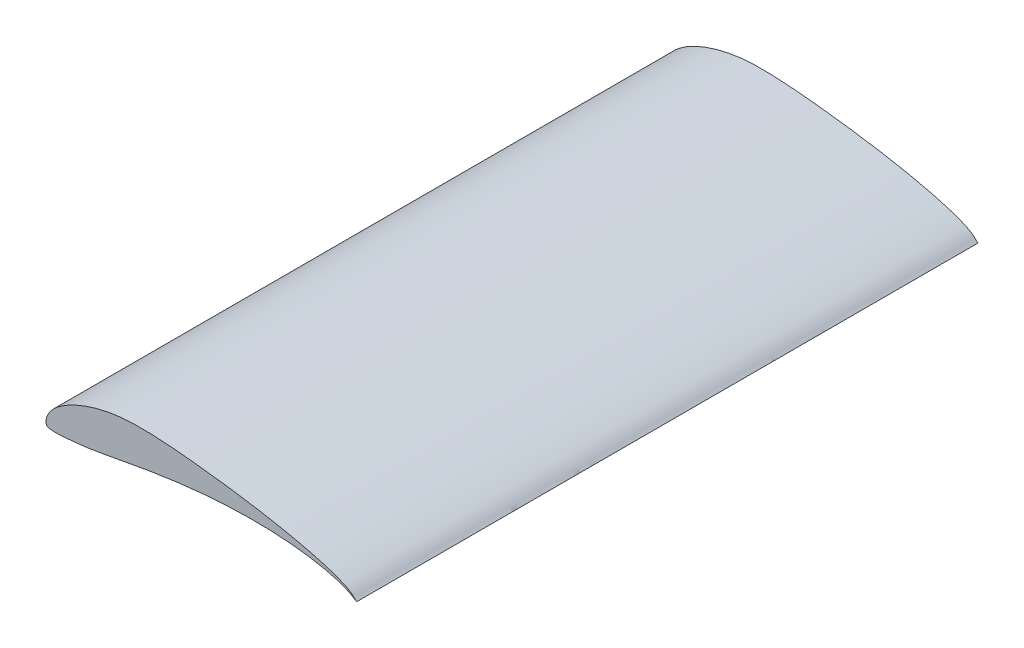
ISO-10303-21;
HEADER;
FILE_DESCRIPTION(('STEP AP214'),'2;1');
FILE_NAME('part.step','',(''),(''),'','','');
FILE_SCHEMA(('AUTOMOTIVE_DESIGN { 1 0 10303 214 1 1 1 1 }'));
ENDSEC;
DATA;
#1=APPLICATION_CONTEXT('core data for automotive mechanical design processes');
#2=APPLICATION_PROTOCOL_DEFINITION('international standard','automotive_design',2000,#1);
#3=PRODUCT_CONTEXT('',#1,'mechanical');
#4=PRODUCT('Part','Part','',(#3));
#5=PRODUCT_RELATED_PRODUCT_CATEGORY('part','',(#4));
#6=PRODUCT_DEFINITION_FORMATION('','',#4);
#7=PRODUCT_DEFINITION_CONTEXT('part definition',#1,'design');
#8=PRODUCT_DEFINITION('design','',#6,#7);
#9=PRODUCT_DEFINITION_SHAPE('','',#8);
#10=(LENGTH_UNIT() NAMED_UNIT(*) SI_UNIT(.MILLI.,.METRE.));
#11=(NAMED_UNIT(*) PLANE_ANGLE_UNIT() SI_UNIT($,.RADIAN.));
#12=(NAMED_UNIT(*) SI_UNIT($,.STERADIAN.) SOLID_ANGLE_UNIT());
#13=UNCERTAINTY_MEASURE_WITH_UNIT(LENGTH_MEASURE(1.E-05),#10,'distance_accuracy_value','');
#14=(GEOMETRIC_REPRESENTATION_CONTEXT(3) GLOBAL_UNCERTAINTY_ASSIGNED_CONTEXT((#13)) GLOBAL_UNIT_ASSIGNED_CONTEXT((#10,
#11,#12)) REPRESENTATION_CONTEXT('',''));
#15=CARTESIAN_POINT('',(0.,0.,0.));
#16=DIRECTION('',(0.,0.,1.));
#17=DIRECTION('',(1.,0.,0.));
#18=AXIS2_PLACEMENT_3D('',#15,#16,#17);
#19=CARTESIAN_POINT('',(127.,0.,254.));
#20=CARTESIAN_POINT('',(127.000769717104,0.00323111728238874,254.));
#21=CARTESIAN_POINT('',(126.584141571627,0.315526649127548,254.));
#22=CARTESIAN_POINT('',(126.232031088116,0.663013823384949,254.));
#23=CARTESIAN_POINT('',(125.450071515346,1.38894381615488,254.));
#24=CARTESIAN_POINT('',(124.527299188332,2.16145764303241,254.));
#25=CARTESIAN_POINT('',(123.264224261657,2.94120075058822,254.));
#26=CARTESIAN_POINT('',(121.692964678594,3.69786480489537,254.));
#27=CARTESIAN_POINT('',(119.795728434605,4.48828044969158,254.));
#28=CARTESIAN_POINT('',(117.575379306662,5.30151004594058,254.));
#29=CARTESIAN_POINT('',(115.042270284879,6.13182416217699,254.));
#30=CARTESIAN_POINT('',(112.209543307113,6.97203931013939,254.));
#31=CARTESIAN_POINT('',(109.093063036859,7.81820448790323,254.));
#32=CARTESIAN_POINT('',(105.710028463209,8.66258332306238,254.));
#33=CARTESIAN_POINT('',(102.079831769463,9.49907815033768,254.));
#34=CARTESIAN_POINT('',(98.2241091397372,10.3224672327435,254.));
#35=CARTESIAN_POINT('',(94.1664076748728,11.1285069384014,254.));
#36=CARTESIAN_POINT('',(89.9304279655555,11.907354391189,254.));
#37=CARTESIAN_POINT('',(85.5428555735686,12.6578371250276,254.));
#38=CARTESIAN_POINT('',(81.0289612385541,13.3703816088197,254.));
#39=CARTESIAN_POINT('',(76.4179534766854,14.0462691823256,254.));
#40=CARTESIAN_POINT('',(71.7393804373853,14.6801640087939,254.));
#41=CARTESIAN_POINT('',(67.027136305624,15.2699828938957,254.));
#42=CARTESIAN_POINT('',(62.3189170365685,15.819696414956,254.));
#43=CARTESIAN_POINT('',(57.6536733692796,16.315664975441,254.));
#44=CARTESIAN_POINT('',(53.0693975715884,16.7487487072031,254.));
#45=CARTESIAN_POINT('',(48.5982718516275,17.0952249192146,254.));
#46=CARTESIAN_POINT('',(44.2657908448699,17.3371937722352,254.));
#47=CARTESIAN_POINT('',(40.0959852964538,17.4483403282716,254.));
#48=CARTESIAN_POINT('',(36.1102779812264,17.4493292025915,254.));
#49=CARTESIAN_POINT('',(32.3158867258376,17.2651586305284,254.));
#50=CARTESIAN_POINT('',(28.7112964421394,16.8801239890788,254.));
#51=CARTESIAN_POINT('',(25.2819441912323,16.3308530728459,254.));
#52=CARTESIAN_POINT('',(22.0269983212429,15.6158399508502,254.));
#53=CARTESIAN_POINT('',(18.9499169212991,14.7752462603599,254.));
#54=CARTESIAN_POINT('',(16.0637526450945,13.8240801560353,254.));
#55=CARTESIAN_POINT('',(13.3808332120453,12.7847443469678,254.));
#56=CARTESIAN_POINT('',(10.9178280022335,11.6628005697599,254.));
#57=CARTESIAN_POINT('',(8.68269161985856,10.4811492130559,254.));
#58=CARTESIAN_POINT('',(6.68760433730356,9.25326624654448,254.));
#59=CARTESIAN_POINT('',(4.94510354432059,7.9958325077971,254.));
#60=CARTESIAN_POINT('',(3.45598413292439,6.73560541904248,254.));
#61=CARTESIAN_POINT('',(2.2417479304945,5.45871938189445,254.));
#62=CARTESIAN_POINT('',(1.30818660016137,4.17624592770146,254.));
#63=CARTESIAN_POINT('',(0.617717297341459,2.92793982113451,254.));
#64=CARTESIAN_POINT('',(0.174083023561414,1.74211895284198,254.));
#65=CARTESIAN_POINT('',(-0.0388427252765965,0.647037813552721,254.));
#66=CARTESIAN_POINT('',(-0.0010363601489231,-0.279771871501658,254.));
#67=CARTESIAN_POINT('',(0.235084443775435,-1.13038870603616,254.));
#68=CARTESIAN_POINT('',(1.1207056730532,-1.55486500810244,254.));
#69=CARTESIAN_POINT('',(2.31290546534907,-1.6175084795852,254.));
#70=CARTESIAN_POINT('',(3.94389865384399,-1.67959896057599,254.));
#71=CARTESIAN_POINT('',(5.99545250140033,-1.59707940753716,254.));
#72=CARTESIAN_POINT('',(8.44417570451747,-1.44160929478364,254.));
#73=CARTESIAN_POINT('',(11.262890425615,-1.18938590251411,254.));
#74=CARTESIAN_POINT('',(14.4227440425413,-0.84622408188668,254.));
#75=CARTESIAN_POINT('',(17.908355129713,-0.404519447860457,254.));
#76=CARTESIAN_POINT('',(21.7182529770942,0.215901377104077,254.));
#77=CARTESIAN_POINT('',(25.8709229619219,0.995707517581131,254.));
#78=CARTESIAN_POINT('',(30.3868524277044,1.8443955725859,254.));
#79=CARTESIAN_POINT('',(35.2439169835582,2.74023122487108,254.));
#80=CARTESIAN_POINT('',(40.4115163949612,3.64553629731007,254.));
#81=CARTESIAN_POINT('',(45.8516192348338,4.52588455050029,254.));
#82=CARTESIAN_POINT('',(51.5219543271074,5.35147544565327,254.));
#83=CARTESIAN_POINT('',(57.3735865939118,6.09156296095057,254.));
#84=CARTESIAN_POINT('',(63.3538498532729,6.72425683934594,254.));
#85=CARTESIAN_POINT('',(69.4061860873322,7.22054004646335,254.));
#86=CARTESIAN_POINT('',(75.4698348185654,7.56721152273309,254.));
#87=CARTESIAN_POINT('',(81.4814157934521,7.75004539608128,254.));
#88=CARTESIAN_POINT('',(87.3756884947152,7.75827737570897,254.));
#89=CARTESIAN_POINT('',(93.086888922288,7.59037940222622,254.));
#90=CARTESIAN_POINT('',(98.5496256871399,7.25008430517508,254.));
#91=CARTESIAN_POINT('',(103.698210977527,6.7417689268573,254.));
#92=CARTESIAN_POINT('',(108.471385615122,6.08455022754242,254.));
#93=CARTESIAN_POINT('',(112.807034181474,5.29727715125957,254.));
#94=CARTESIAN_POINT('',(116.654371920803,4.40604318114848,254.));
#95=CARTESIAN_POINT('',(119.94257377723,3.45478126323133,254.));
#96=CARTESIAN_POINT('',(122.63294953606,2.44188293526373,254.));
#97=CARTESIAN_POINT('',(124.551876795575,1.51652312091327,254.));
#98=CARTESIAN_POINT('',(125.96615188119,0.661946325670215,254.));
#99=CARTESIAN_POINT('',(126.509448596035,0.331250792648228,254.));
#100=CARTESIAN_POINT('',(126.999214634617,-0.00329680560459764,254.));
#101=CARTESIAN_POINT('',(127.,0.,254.));
#102=B_SPLINE_CURVE_WITH_KNOTS('',3,(#19,#20,#21,#22,#23,#24,#25,#26,#27,#28,#29,#30,#31,#32,
#33,#34,#35,#36,#37,#38,#39,#40,#41,#42,#43,#44,#45,#46,#47,#48,#49,#50,#51,#52,#53,#54,#55,#56,
#57,#58,#59,#60,#61,#62,#63,#64,#65,#66,#67,#68,#69,#70,#71,#72,#73,#74,#75,#76,#77,#78,#79,#80,
#81,#82,#83,#84,#85,#86,#87,#88,#89,#90,#91,#92,#93,#94,#95,#96,#97,#98,#99,#100,#101),
.UNSPECIFIED.,.T.,.F.,(4,1,1,1,1,1,1,1,1,1,1,1,1,1,1,1,1,1,1,1,1,1,1,1,1,1,1,1,1,1,1,1,1,1,1,1,
1,1,1,1,1,1,1,1,1,1,1,1,1,1,1,1,1,1,1,1,1,1,1,1,1,1,1,1,1,1,1,1,1,1,1,1,1,1,1,1,1,1,1,1,4),(0.,
0.000979677557134158,0.00364886216776312,0.00748349851947815,0.0120952771855934,
0.0175255907768788,0.0240517799938711,0.0317830505527587,0.0406778280832618,0.050710300790478,
0.0618332290621795,0.0739892504845854,0.0871181731906812,0.101145048769791,0.115990637111827,
0.131570421640589,0.147788379302961,0.164550916882416,0.181757895150531,0.199311954944345,
0.217095071712264,0.234990228463986,0.252856883122009,0.270540593729572,0.287886779266045,
0.304773437599674,0.321101419214061,0.336806063174811,0.351800032584037,0.366031063392082,
0.379615674919835,0.392652962879186,0.405170358707495,0.417171919049936,0.428603516911185,
0.439418959108259,0.449596586064162,0.459102079103161,0.467907877534646,0.475988300736527,
0.483308968746149,0.489874507816402,0.495803249719207,0.501149411695553,0.50590307325604,
0.510046768536663,0.513579310681042,0.516446926626751,0.5193500525909,0.523823355179486,
0.529973793997694,0.537715654387927,0.546967844488146,0.55763736682571,0.569620481096633,
0.582804124215616,0.597246960791632,0.613135036654701,0.630443600329816,0.649056123608545,
0.668822256795696,0.689594964002684,0.711189650864602,0.733426688964389,0.756094117504156,
0.778988553684861,0.801889682684954,0.824566597829707,0.846792284880411,0.868338290507787,
0.888978162959066,0.908492011340558,0.926658767581933,0.943286193042322,0.958169210358795,
0.971135821634751,0.981955623079976,0.990251791025976,0.995852565249962,0.999000405686701,1.),.UNSPECIFIED.);
#103=DIRECTION('',(0.,0.,-1.));
#104=VECTOR('',#103,1.);
#105=SURFACE_OF_LINEAR_EXTRUSION('',#102,#104);
#106=CARTESIAN_POINT('',(127.,0.,254.));
#107=VERTEX_POINT('',#106);
#108=EDGE_CURVE('E10',#107,#107,#102,.T.);
#109=ORIENTED_EDGE('',*,*,#108,.F.);
#110=EDGE_LOOP('',(#109));
#111=FACE_BOUND('',#110,.T.);
#112=CARTESIAN_POINT('',(127.,0.,0.));
#113=CARTESIAN_POINT('',(127.000769717104,0.00323111728238874,0.));
#114=CARTESIAN_POINT('',(126.584141571627,0.315526649127548,0.));
#115=CARTESIAN_POINT('',(126.232031088116,0.663013823384949,0.));
#116=CARTESIAN_POINT('',(125.450071515346,1.38894381615488,0.));
#117=CARTESIAN_POINT('',(124.527299188332,2.16145764303241,0.));
#118=CARTESIAN_POINT('',(123.264224261657,2.94120075058822,0.));
#119=CARTESIAN_POINT('',(121.692964678594,3.69786480489537,0.));
#120=CARTESIAN_POINT('',(119.795728434605,4.48828044969158,0.));
#121=CARTESIAN_POINT('',(117.575379306662,5.30151004594058,0.));
#122=CARTESIAN_POINT('',(115.042270284879,6.13182416217699,0.));
#123=CARTESIAN_POINT('',(112.209543307113,6.97203931013939,0.));
#124=CARTESIAN_POINT('',(109.093063036859,7.81820448790323,0.));
#125=CARTESIAN_POINT('',(105.710028463209,8.66258332306238,0.));
#126=CARTESIAN_POINT('',(102.079831769463,9.49907815033768,0.));
#127=CARTESIAN_POINT('',(98.2241091397372,10.3224672327435,0.));
#128=CARTESIAN_POINT('',(94.1664076748728,11.1285069384014,0.));
#129=CARTESIAN_POINT('',(89.9304279655555,11.907354391189,0.));
#130=CARTESIAN_POINT('',(85.5428555735686,12.6578371250276,0.));
#131=CARTESIAN_POINT('',(81.0289612385541,13.3703816088197,0.));
#132=CARTESIAN_POINT('',(76.4179534766854,14.0462691823256,0.));
#133=CARTESIAN_POINT('',(71.7393804373853,14.6801640087939,0.));
#134=CARTESIAN_POINT('',(67.027136305624,15.2699828938957,0.));
#135=CARTESIAN_POINT('',(62.3189170365685,15.819696414956,0.));
#136=CARTESIAN_POINT('',(57.6536733692796,16.315664975441,0.));
#137=CARTESIAN_POINT('',(53.0693975715884,16.7487487072031,0.));
#138=CARTESIAN_POINT('',(48.5982718516275,17.0952249192146,0.));
#139=CARTESIAN_POINT('',(44.2657908448699,17.3371937722352,0.));
#140=CARTESIAN_POINT('',(40.0959852964538,17.4483403282716,0.));
#141=CARTESIAN_POINT('',(36.1102779812264,17.4493292025915,0.));
#142=CARTESIAN_POINT('',(32.3158867258376,17.2651586305284,0.));
#143=CARTESIAN_POINT('',(28.7112964421394,16.8801239890788,0.));
#144=CARTESIAN_POINT('',(25.2819441912323,16.3308530728459,0.));
#145=CARTESIAN_POINT('',(22.0269983212429,15.6158399508502,0.));
#146=CARTESIAN_POINT('',(18.9499169212991,14.7752462603599,0.));
#147=CARTESIAN_POINT('',(16.0637526450945,13.8240801560353,0.));
#148=CARTESIAN_POINT('',(13.3808332120453,12.7847443469678,0.));
#149=CARTESIAN_POINT('',(10.9178280022335,11.6628005697599,0.));
#150=CARTESIAN_POINT('',(8.68269161985856,10.4811492130559,0.));
#151=CARTESIAN_POINT('',(6.68760433730356,9.25326624654448,0.));
#152=CARTESIAN_POINT('',(4.94510354432059,7.9958325077971,0.));
#153=CARTESIAN_POINT('',(3.45598413292439,6.73560541904248,0.));
#154=CARTESIAN_POINT('',(2.2417479304945,5.45871938189445,0.));
#155=CARTESIAN_POINT('',(1.30818660016137,4.17624592770146,0.));
#156=CARTESIAN_POINT('',(0.617717297341459,2.92793982113451,0.));
#157=CARTESIAN_POINT('',(0.174083023561414,1.74211895284198,0.));
#158=CARTESIAN_POINT('',(-0.0388427252765965,0.647037813552721,0.));
#159=CARTESIAN_POINT('',(-0.0010363601489231,-0.279771871501658,0.));
#160=CARTESIAN_POINT('',(0.235084443775435,-1.13038870603616,0.));
#161=CARTESIAN_POINT('',(1.1207056730532,-1.55486500810244,0.));
#162=CARTESIAN_POINT('',(2.31290546534907,-1.6175084795852,0.));
#163=CARTESIAN_POINT('',(3.94389865384399,-1.67959896057599,0.));
#164=CARTESIAN_POINT('',(5.99545250140033,-1.59707940753716,0.));
#165=CARTESIAN_POINT('',(8.44417570451747,-1.44160929478364,0.));
#166=CARTESIAN_POINT('',(11.262890425615,-1.18938590251411,0.));
#167=CARTESIAN_POINT('',(14.4227440425413,-0.84622408188668,0.));
#168=CARTESIAN_POINT('',(17.908355129713,-0.404519447860457,0.));
#169=CARTESIAN_POINT('',(21.7182529770942,0.215901377104077,0.));
#170=CARTESIAN_POINT('',(25.8709229619219,0.995707517581131,0.));
#171=CARTESIAN_POINT('',(30.3868524277044,1.8443955725859,0.));
#172=CARTESIAN_POINT('',(35.2439169835582,2.74023122487108,0.));
#173=CARTESIAN_POINT('',(40.4115163949612,3.64553629731007,0.));
#174=CARTESIAN_POINT('',(45.8516192348338,4.52588455050029,0.));
#175=CARTESIAN_POINT('',(51.5219543271074,5.35147544565327,0.));
#176=CARTESIAN_POINT('',(57.3735865939118,6.09156296095057,0.));
#177=CARTESIAN_POINT('',(63.3538498532729,6.72425683934594,0.));
#178=CARTESIAN_POINT('',(69.4061860873322,7.22054004646335,0.));
#179=CARTESIAN_POINT('',(75.4698348185654,7.56721152273309,0.));
#180=CARTESIAN_POINT('',(81.4814157934521,7.75004539608128,0.));
#181=CARTESIAN_POINT('',(87.3756884947152,7.75827737570897,0.));
#182=CARTESIAN_POINT('',(93.086888922288,7.59037940222622,0.));
#183=CARTESIAN_POINT('',(98.5496256871399,7.25008430517508,0.));
#184=CARTESIAN_POINT('',(103.698210977527,6.7417689268573,0.));
#185=CARTESIAN_POINT('',(108.471385615122,6.08455022754242,0.));
#186=CARTESIAN_POINT('',(112.807034181474,5.29727715125957,0.));
#187=CARTESIAN_POINT('',(116.654371920803,4.40604318114848,0.));
#188=CARTESIAN_POINT('',(119.94257377723,3.45478126323133,0.));
#189=CARTESIAN_POINT('',(122.63294953606,2.44188293526373,0.));
#190=CARTESIAN_POINT('',(124.551876795575,1.51652312091327,0.));
#191=CARTESIAN_POINT('',(125.96615188119,0.661946325670215,0.));
#192=CARTESIAN_POINT('',(126.509448596035,0.331250792648228,0.));
#193=CARTESIAN_POINT('',(126.999214634617,-0.00329680560459764,0.));
#194=CARTESIAN_POINT('',(127.,0.,0.));
#195=B_SPLINE_CURVE_WITH_KNOTS('',3,(#112,#113,#114,#115,#116,#117,#118,#119,#120,#121,#122,
#123,#124,#125,#126,#127,#128,#129,#130,#131,#132,#133,#134,#135,#136,#137,#138,#139,#140,#141,
#142,#143,#144,#145,#146,#147,#148,#149,#150,#151,#152,#153,#154,#155,#156,#157,#158,#159,#160,
#161,#162,#163,#164,#165,#166,#167,#168,#169,#170,#171,#172,#173,#174,#175,#176,#177,#178,#179,
#180,#181,#182,#183,#184,#185,#186,#187,#188,#189,#190,#191,#192,#193,#194),.UNSPECIFIED.,.T.,
.F.,(4,1,1,1,1,1,1,1,1,1,1,1,1,1,1,1,1,1,1,1,1,1,1,1,1,1,1,1,1,1,1,1,1,1,1,1,1,1,1,1,1,1,1,1,1,
1,1,1,1,1,1,1,1,1,1,1,1,1,1,1,1,1,1,1,1,1,1,1,1,1,1,1,1,1,1,1,1,1,1,1,4),(0.,
0.000979677557134158,0.00364886216776312,0.00748349851947815,0.0120952771855934,
0.0175255907768788,0.0240517799938711,0.0317830505527587,0.0406778280832618,0.050710300790478,
0.0618332290621795,0.0739892504845854,0.0871181731906812,0.101145048769791,0.115990637111827,
0.131570421640589,0.147788379302961,0.164550916882416,0.181757895150531,0.199311954944345,
0.217095071712264,0.234990228463986,0.252856883122009,0.270540593729572,0.287886779266045,
0.304773437599674,0.321101419214061,0.336806063174811,0.351800032584037,0.366031063392082,
0.379615674919835,0.392652962879186,0.405170358707495,0.417171919049936,0.428603516911185,
0.439418959108259,0.449596586064162,0.459102079103161,0.467907877534646,0.475988300736527,
0.483308968746149,0.489874507816402,0.495803249719207,0.501149411695553,0.50590307325604,
0.510046768536663,0.513579310681042,0.516446926626751,0.5193500525909,0.523823355179486,
0.529973793997694,0.537715654387927,0.546967844488146,0.55763736682571,0.569620481096633,
0.582804124215616,0.597246960791632,0.613135036654701,0.630443600329816,0.649056123608545,
0.668822256795696,0.689594964002684,0.711189650864602,0.733426688964389,0.756094117504156,
0.778988553684861,0.801889682684954,0.824566597829707,0.846792284880411,0.868338290507787,
0.888978162959066,0.908492011340558,0.926658767581933,0.943286193042322,0.958169210358795,
0.971135821634751,0.981955623079976,0.990251791025976,0.995852565249962,0.999000405686701,1.),.UNSPECIFIED.);
#196=CARTESIAN_POINT('',(127.,0.,0.));
#197=VERTEX_POINT('',#196);
#198=EDGE_CURVE('E34',#197,#197,#195,.T.);
#199=ORIENTED_EDGE('',*,*,#198,.T.);
#200=EDGE_LOOP('',(#199));
#201=FACE_BOUND('',#200,.T.);
#202=ADVANCED_FACE('F30',(#111,#201),#105,.F.);
#203=CARTESIAN_POINT('',(0.757300870586866,3.14283800308935,254.));
#204=DIRECTION('',(0.,0.,-1.));
#205=DIRECTION('',(-1.,0.,0.));
#206=AXIS2_PLACEMENT_3D('',#203,#204,#205);
#207=PLANE('',#206);
#208=ORIENTED_EDGE('',*,*,#108,.T.);
#209=EDGE_LOOP('',(#208));
#210=FACE_BOUND('',#209,.T.);
#211=ADVANCED_FACE('F53',(#210),#207,.F.);
#212=CARTESIAN_POINT('',(0.757300870586866,3.14283800308935,0.));
#213=DIRECTION('',(0.,0.,-1.));
#214=DIRECTION('',(-1.,0.,0.));
#215=AXIS2_PLACEMENT_3D('',#212,#213,#214);
#216=PLANE('',#215);
#217=ORIENTED_EDGE('',*,*,#198,.F.);
#218=EDGE_LOOP('',(#217));
#219=FACE_BOUND('',#218,.T.);
#220=ADVANCED_FACE('F51',(#219),#216,.T.);
#221=CLOSED_SHELL('',(#202,#211,#220));
#222=MANIFOLD_SOLID_BREP('B2',#221);
#223=ADVANCED_BREP_SHAPE_REPRESENTATION('',(#18,#222),#14);
#224=SHAPE_DEFINITION_REPRESENTATION(#9,#223);
ENDSEC;
END-ISO-10303-21;
